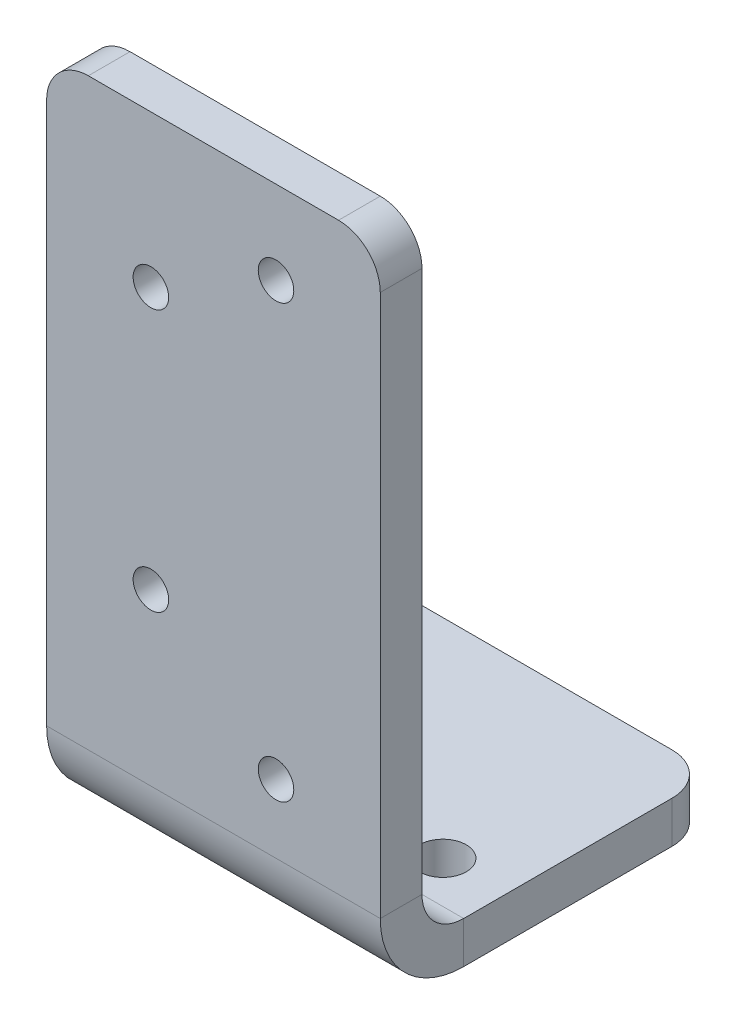
ISO-10303-21;
HEADER;
FILE_DESCRIPTION(('STEP AP214'),'2;1');
FILE_NAME('part.step','',(''),(''),'','','');
FILE_SCHEMA(('AUTOMOTIVE_DESIGN { 1 0 10303 214 1 1 1 1 }'));
ENDSEC;
DATA;
#1=APPLICATION_CONTEXT('core data for automotive mechanical design processes');
#2=APPLICATION_PROTOCOL_DEFINITION('international standard','automotive_design',2000,#1);
#3=PRODUCT_CONTEXT('',#1,'mechanical');
#4=PRODUCT('Part','Part','',(#3));
#5=PRODUCT_RELATED_PRODUCT_CATEGORY('part','',(#4));
#6=PRODUCT_DEFINITION_FORMATION('','',#4);
#7=PRODUCT_DEFINITION_CONTEXT('part definition',#1,'design');
#8=PRODUCT_DEFINITION('design','',#6,#7);
#9=PRODUCT_DEFINITION_SHAPE('','',#8);
#10=(LENGTH_UNIT() NAMED_UNIT(*) SI_UNIT(.MILLI.,.METRE.));
#11=(NAMED_UNIT(*) PLANE_ANGLE_UNIT() SI_UNIT($,.RADIAN.));
#12=(NAMED_UNIT(*) SI_UNIT($,.STERADIAN.) SOLID_ANGLE_UNIT());
#13=UNCERTAINTY_MEASURE_WITH_UNIT(LENGTH_MEASURE(1.E-05),#10,'distance_accuracy_value','');
#14=(GEOMETRIC_REPRESENTATION_CONTEXT(3) GLOBAL_UNCERTAINTY_ASSIGNED_CONTEXT((#13)) GLOBAL_UNIT_ASSIGNED_CONTEXT((#10,
#11,#12)) REPRESENTATION_CONTEXT('',''));
#15=CARTESIAN_POINT('',(0.,0.,0.));
#16=DIRECTION('',(0.,0.,1.));
#17=DIRECTION('',(1.,0.,0.));
#18=AXIS2_PLACEMENT_3D('',#15,#16,#17);
#19=CARTESIAN_POINT('',(50.7999999999997,6.34999999999952,-12.7));
#20=DIRECTION('',(1.,0.,0.));
#21=DIRECTION('',(0.,0.,-1.00000000000001));
#22=AXIS2_PLACEMENT_3D('',#19,#20,#21);
#23=PLANE('',#22);
#24=DIRECTION('',(0.,-1.,0.));
#25=VECTOR('',#24,1.);
#26=CARTESIAN_POINT('',(50.8000000000002,101.6,-6.35000000000008));
#27=LINE('',#26,#25);
#28=CARTESIAN_POINT('',(50.7999999999997,95.2500000000001,-6.34999999999997));
#29=VERTEX_POINT('',#28);
#30=CARTESIAN_POINT('',(50.8000000000002,12.6999999999998,-6.3500000133348));
#31=VERTEX_POINT('',#30);
#32=EDGE_CURVE('E226',#29,#31,#27,.T.);
#33=ORIENTED_EDGE('',*,*,#32,.F.);
#34=DIRECTION('',(0.,0.,-1.00000000000001));
#35=VECTOR('',#34,1.);
#36=CARTESIAN_POINT('',(50.7999999999997,95.2500000000001,-12.7));
#37=LINE('',#36,#35);
#38=CARTESIAN_POINT('',(50.7999999999997,95.2499999999998,0.));
#39=VERTEX_POINT('',#38);
#40=EDGE_CURVE('E254',#29,#39,#37,.F.);
#41=ORIENTED_EDGE('',*,*,#40,.T.);
#42=DIRECTION('',(0.,-1.,0.));
#43=VECTOR('',#42,1.);
#44=CARTESIAN_POINT('',(50.8000000000002,101.6,0.));
#45=LINE('',#44,#43);
#46=CARTESIAN_POINT('',(50.7999999999997,12.7000000000004,-8.89005535853471E-09));
#47=VERTEX_POINT('',#46);
#48=EDGE_CURVE('E229',#39,#47,#45,.T.);
#49=ORIENTED_EDGE('',*,*,#48,.T.);
#50=DIRECTION('',(0.,0.,-1.00000000000001));
#51=VECTOR('',#50,1.);
#52=CARTESIAN_POINT('',(50.8000000000006,12.699999999999,0.));
#53=LINE('',#52,#51);
#54=EDGE_CURVE('E265',#47,#31,#53,.T.);
#55=ORIENTED_EDGE('',*,*,#54,.T.);
#56=EDGE_LOOP('',(#33,#41,#49,#55));
#57=FACE_BOUND('',#56,.T.);
#58=ADVANCED_FACE('F40',(#57),#23,.T.);
#59=CARTESIAN_POINT('',(50.8000000000002,101.6,-6.35000000000008));
#60=DIRECTION('',(0.,0.,-1.00000000000001));
#61=DIRECTION('',(0.,1.,0.));
#62=AXIS2_PLACEMENT_3D('',#59,#60,#61);
#63=PLANE('',#62);
#64=CARTESIAN_POINT('',(15.8749999999999,78.4859999999998,-6.34999999999997));
#65=DIRECTION('',(0.,0.,-1.00000000000001));
#66=DIRECTION('',(0.,1.,0.));
#67=AXIS2_PLACEMENT_3D('',#64,#65,#66);
#68=CIRCLE('',#67,2.70510000000001);
#69=CARTESIAN_POINT('',(15.8749999999999,81.1910999999998,-6.34999999999997));
#70=VERTEX_POINT('',#69);
#71=EDGE_CURVE('E140',#70,#70,#68,.T.);
#72=ORIENTED_EDGE('',*,*,#71,.F.);
#73=EDGE_LOOP('',(#72));
#74=FACE_BOUND('',#73,.T.);
#75=CARTESIAN_POINT('',(15.8750000000007,38.6080000000006,-6.35000000000008));
#76=DIRECTION('',(0.,0.,-1.00000000000001));
#77=DIRECTION('',(0.,1.,0.));
#78=AXIS2_PLACEMENT_3D('',#75,#76,#77);
#79=CIRCLE('',#78,2.7051);
#80=CARTESIAN_POINT('',(15.8750000000007,41.3131000000006,-6.35000000000008));
#81=VERTEX_POINT('',#80);
#82=EDGE_CURVE('E209',#81,#81,#79,.T.);
#83=ORIENTED_EDGE('',*,*,#82,.F.);
#84=EDGE_LOOP('',(#83));
#85=FACE_BOUND('',#84,.T.);
#86=CARTESIAN_POINT('',(34.9249999999999,88.9000000000002,-6.35000000000008));
#87=DIRECTION('',(0.,0.,-1.00000000000001));
#88=DIRECTION('',(0.,1.,0.));
#89=AXIS2_PLACEMENT_3D('',#86,#87,#88);
#90=CIRCLE('',#89,2.70510000000001);
#91=CARTESIAN_POINT('',(34.9249999999999,91.6051000000002,-6.35000000000008));
#92=VERTEX_POINT('',#91);
#93=EDGE_CURVE('E213',#92,#92,#90,.T.);
#94=ORIENTED_EDGE('',*,*,#93,.F.);
#95=EDGE_LOOP('',(#94));
#96=FACE_BOUND('',#95,.T.);
#97=CARTESIAN_POINT('',(34.9249999999999,23.1139999999999,-6.34999999999997));
#98=DIRECTION('',(0.,0.,-1.00000000000001));
#99=DIRECTION('',(0.,1.,0.));
#100=AXIS2_PLACEMENT_3D('',#97,#98,#99);
#101=CIRCLE('',#100,2.70509999999999);
#102=CARTESIAN_POINT('',(34.9249999999999,25.8190999999999,-6.34999999999997));
#103=VERTEX_POINT('',#102);
#104=EDGE_CURVE('E217',#103,#103,#101,.T.);
#105=ORIENTED_EDGE('',*,*,#104,.F.);
#106=EDGE_LOOP('',(#105));
#107=FACE_BOUND('',#106,.T.);
#108=DIRECTION('',(-1.,0.,0.));
#109=VECTOR('',#108,1.);
#110=CARTESIAN_POINT('',(50.8000000000002,101.6,-6.35000000000008));
#111=LINE('',#110,#109);
#112=CARTESIAN_POINT('',(44.4499999999999,101.6,-6.35000000000002));
#113=VERTEX_POINT('',#112);
#114=CARTESIAN_POINT('',(6.34999999999986,101.6,-6.35000000000013));
#115=VERTEX_POINT('',#114);
#116=EDGE_CURVE('E234',#113,#115,#111,.T.);
#117=ORIENTED_EDGE('',*,*,#116,.F.);
#118=CARTESIAN_POINT('',(44.4500000000003,95.2500000000003,-6.34999999999991));
#119=DIRECTION('',(0.,0.,-1.00000000000001));
#120=DIRECTION('',(0.,1.,0.));
#121=AXIS2_PLACEMENT_3D('',#118,#119,#120);
#122=CIRCLE('',#121,6.35);
#123=EDGE_CURVE('E252',#113,#29,#122,.T.);
#124=ORIENTED_EDGE('',*,*,#123,.T.);
#125=ORIENTED_EDGE('',*,*,#32,.T.);
#126=DIRECTION('',(-1.,0.,0.));
#127=VECTOR('',#126,1.);
#128=CARTESIAN_POINT('',(50.8000000000006,12.699999999999,-6.34999999999991));
#129=LINE('',#128,#127);
#130=CARTESIAN_POINT('',(0.,12.6999999999995,-6.3500000133348));
#131=VERTEX_POINT('',#130);
#132=EDGE_CURVE('E262',#31,#131,#129,.T.);
#133=ORIENTED_EDGE('',*,*,#132,.T.);
#134=DIRECTION('',(0.,-1.,0.));
#135=VECTOR('',#134,1.);
#136=CARTESIAN_POINT('',(0.,101.6,-6.34999999999997));
#137=LINE('',#136,#135);
#138=CARTESIAN_POINT('',(0.,95.2500000000006,-6.35000000000002));
#139=VERTEX_POINT('',#138);
#140=EDGE_CURVE('E221',#139,#131,#137,.T.);
#141=ORIENTED_EDGE('',*,*,#140,.F.);
#142=CARTESIAN_POINT('',(6.34999999999986,95.2499999999993,-6.34999999999986));
#143=DIRECTION('',(0.,0.,-1.00000000000001));
#144=DIRECTION('',(0.,1.,0.));
#145=AXIS2_PLACEMENT_3D('',#142,#143,#144);
#146=CIRCLE('',#145,6.35);
#147=EDGE_CURVE('E250',#139,#115,#146,.T.);
#148=ORIENTED_EDGE('',*,*,#147,.T.);
#149=EDGE_LOOP('',(#117,#124,#125,#133,#141,#148));
#150=FACE_BOUND('',#149,.T.);
#151=ADVANCED_FACE('F304',(#74,#85,#96,#107,#150),#63,.T.);
#152=CARTESIAN_POINT('',(50.8000000000002,101.6,0.));
#153=DIRECTION('',(0.,1.,0.));
#154=DIRECTION('',(0.,0.,1.00000000000001));
#155=AXIS2_PLACEMENT_3D('',#152,#153,#154);
#156=PLANE('',#155);
#157=DIRECTION('',(-1.,0.,0.));
#158=VECTOR('',#157,1.);
#159=CARTESIAN_POINT('',(50.8000000000002,101.6,0.));
#160=LINE('',#159,#158);
#161=CARTESIAN_POINT('',(44.4500000000003,101.6,-1.11022302462516E-13));
#162=VERTEX_POINT('',#161);
#163=CARTESIAN_POINT('',(6.3500000000003,101.6,1.66533453693773E-13));
#164=VERTEX_POINT('',#163);
#165=EDGE_CURVE('E232',#162,#164,#160,.T.);
#166=ORIENTED_EDGE('',*,*,#165,.F.);
#167=DIRECTION('',(0.,0.,-1.00000000000001));
#168=VECTOR('',#167,1.);
#169=CARTESIAN_POINT('',(44.4500000000003,101.6,-1.11022302462516E-13));
#170=LINE('',#169,#168);
#171=EDGE_CURVE('E247',#162,#113,#170,.T.);
#172=ORIENTED_EDGE('',*,*,#171,.T.);
#173=ORIENTED_EDGE('',*,*,#116,.T.);
#174=DIRECTION('',(0.,0.,-1.00000000000001));
#175=VECTOR('',#174,1.);
#176=CARTESIAN_POINT('',(6.3500000000003,101.6,1.66533453693773E-13));
#177=LINE('',#176,#175);
#178=EDGE_CURVE('E237',#115,#164,#177,.F.);
#179=ORIENTED_EDGE('',*,*,#178,.T.);
#180=EDGE_LOOP('',(#166,#172,#173,#179));
#181=FACE_BOUND('',#180,.T.);
#182=ADVANCED_FACE('F311',(#181),#156,.T.);
#183=CARTESIAN_POINT('',(50.8000000000002,101.6,0.));
#184=DIRECTION('',(0.,0.,-1.00000000000001));
#185=DIRECTION('',(0.,1.,0.));
#186=AXIS2_PLACEMENT_3D('',#183,#184,#185);
#187=PLANE('',#186);
#188=CARTESIAN_POINT('',(15.8749999999999,78.4860000000001,0.));
#189=DIRECTION('',(0.,0.,-1.00000000000001));
#190=DIRECTION('',(0.,1.,0.));
#191=AXIS2_PLACEMENT_3D('',#188,#189,#190);
#192=CIRCLE('',#191,2.70510000000001);
#193=CARTESIAN_POINT('',(15.8749999999999,81.1911000000001,0.));
#194=VERTEX_POINT('',#193);
#195=EDGE_CURVE('E208',#194,#194,#192,.T.);
#196=ORIENTED_EDGE('',*,*,#195,.T.);
#197=EDGE_LOOP('',(#196));
#198=FACE_BOUND('',#197,.T.);
#199=CARTESIAN_POINT('',(15.8750000000003,38.6080000000002,0.));
#200=DIRECTION('',(0.,0.,-1.00000000000001));
#201=DIRECTION('',(0.,1.,0.));
#202=AXIS2_PLACEMENT_3D('',#199,#200,#201);
#203=CIRCLE('',#202,2.7051);
#204=CARTESIAN_POINT('',(15.8750000000003,41.3131000000002,0.));
#205=VERTEX_POINT('',#204);
#206=EDGE_CURVE('E212',#205,#205,#203,.T.);
#207=ORIENTED_EDGE('',*,*,#206,.T.);
#208=EDGE_LOOP('',(#207));
#209=FACE_BOUND('',#208,.T.);
#210=CARTESIAN_POINT('',(34.9249999999999,88.9000000000001,0.));
#211=DIRECTION('',(0.,0.,-1.00000000000001));
#212=DIRECTION('',(0.,1.,0.));
#213=AXIS2_PLACEMENT_3D('',#210,#211,#212);
#214=CIRCLE('',#213,2.70510000000001);
#215=CARTESIAN_POINT('',(34.9249999999999,91.6051000000001,0.));
#216=VERTEX_POINT('',#215);
#217=EDGE_CURVE('E216',#216,#216,#214,.T.);
#218=ORIENTED_EDGE('',*,*,#217,.T.);
#219=EDGE_LOOP('',(#218));
#220=FACE_BOUND('',#219,.T.);
#221=CARTESIAN_POINT('',(34.9249999999999,23.1140000000001,0.));
#222=DIRECTION('',(0.,0.,-1.00000000000001));
#223=DIRECTION('',(0.,1.,0.));
#224=AXIS2_PLACEMENT_3D('',#221,#222,#223);
#225=CIRCLE('',#224,2.70509999999999);
#226=CARTESIAN_POINT('',(34.9249999999999,25.8191000000001,0.));
#227=VERTEX_POINT('',#226);
#228=EDGE_CURVE('E220',#227,#227,#225,.T.);
#229=ORIENTED_EDGE('',*,*,#228,.T.);
#230=EDGE_LOOP('',(#229));
#231=FACE_BOUND('',#230,.T.);
#232=ORIENTED_EDGE('',*,*,#48,.F.);
#233=CARTESIAN_POINT('',(44.4500000000008,95.2499999999999,1.66533453693773E-13));
#234=DIRECTION('',(0.,0.,-1.00000000000001));
#235=DIRECTION('',(0.,1.,0.));
#236=AXIS2_PLACEMENT_3D('',#233,#234,#235);
#237=CIRCLE('',#236,6.35);
#238=EDGE_CURVE('E257',#39,#162,#237,.F.);
#239=ORIENTED_EDGE('',*,*,#238,.T.);
#240=ORIENTED_EDGE('',*,*,#165,.T.);
#241=CARTESIAN_POINT('',(6.34999999999986,95.2499999999998,0.));
#242=DIRECTION('',(0.,0.,-1.00000000000001));
#243=DIRECTION('',(0.,1.,0.));
#244=AXIS2_PLACEMENT_3D('',#241,#242,#243);
#245=CIRCLE('',#244,6.35);
#246=CARTESIAN_POINT('',(0.,95.2500000000003,0.));
#247=VERTEX_POINT('',#246);
#248=EDGE_CURVE('E61',#164,#247,#245,.F.);
#249=ORIENTED_EDGE('',*,*,#248,.T.);
#250=DIRECTION('',(0.,-1.,0.));
#251=VECTOR('',#250,1.);
#252=CARTESIAN_POINT('',(0.,101.6,0.));
#253=LINE('',#252,#251);
#254=CARTESIAN_POINT('',(0.,12.6999999999994,0.));
#255=VERTEX_POINT('',#254);
#256=EDGE_CURVE('E224',#247,#255,#253,.T.);
#257=ORIENTED_EDGE('',*,*,#256,.T.);
#258=DIRECTION('',(-1.,0.,0.));
#259=VECTOR('',#258,1.);
#260=CARTESIAN_POINT('',(50.8000000000006,12.699999999999,0.));
#261=LINE('',#260,#259);
#262=EDGE_CURVE('E47',#47,#255,#261,.T.);
#263=ORIENTED_EDGE('',*,*,#262,.F.);
#264=EDGE_LOOP('',(#232,#239,#240,#249,#257,#263));
#265=FACE_BOUND('',#264,.T.);
#266=ADVANCED_FACE('F313',(#198,#209,#220,#231,#265),#187,.F.);
#267=CARTESIAN_POINT('',(0.,12.6999999999995,-12.7));
#268=DIRECTION('',(1.,0.,0.));
#269=DIRECTION('',(0.,0.,-1.00000000000001));
#270=AXIS2_PLACEMENT_3D('',#267,#268,#269);
#271=PLANE('',#270);
#272=ORIENTED_EDGE('',*,*,#256,.F.);
#273=DIRECTION('',(0.,0.,-1.00000000000001));
#274=VECTOR('',#273,1.);
#275=CARTESIAN_POINT('',(0.,95.2500000000006,-6.35000000000002));
#276=LINE('',#275,#274);
#277=EDGE_CURVE('E259',#247,#139,#276,.T.);
#278=ORIENTED_EDGE('',*,*,#277,.T.);
#279=ORIENTED_EDGE('',*,*,#140,.T.);
#280=DIRECTION('',(0.,0.,1.00000000000001));
#281=VECTOR('',#280,1.);
#282=CARTESIAN_POINT('',(0.,12.6999999999996,-6.35000000000002));
#283=LINE('',#282,#281);
#284=EDGE_CURVE('E11',#131,#255,#283,.T.);
#285=ORIENTED_EDGE('',*,*,#284,.T.);
#286=EDGE_LOOP('',(#272,#278,#279,#285));
#287=FACE_BOUND('',#286,.T.);
#288=ADVANCED_FACE('F318',(#287),#271,.F.);
#289=CARTESIAN_POINT('',(34.9249999999999,23.1139999999996,6.34999999999991));
#290=DIRECTION('',(0.,0.,-1.00000000000001));
#291=DIRECTION('',(0.,1.,0.));
#292=AXIS2_PLACEMENT_3D('',#289,#290,#291);
#293=CYLINDRICAL_SURFACE('',#292,2.70509999999999);
#294=ORIENTED_EDGE('',*,*,#104,.T.);
#295=EDGE_LOOP('',(#294));
#296=FACE_BOUND('',#295,.T.);
#297=ORIENTED_EDGE('',*,*,#228,.F.);
#298=EDGE_LOOP('',(#297));
#299=FACE_BOUND('',#298,.T.);
#300=ADVANCED_FACE('F320',(#296,#299),#293,.F.);
#301=CARTESIAN_POINT('',(34.9249999999999,88.9000000000001,6.34999999999997));
#302=DIRECTION('',(0.,0.,-1.00000000000001));
#303=DIRECTION('',(0.,1.,0.));
#304=AXIS2_PLACEMENT_3D('',#301,#302,#303);
#305=CYLINDRICAL_SURFACE('',#304,2.70510000000001);
#306=ORIENTED_EDGE('',*,*,#93,.T.);
#307=EDGE_LOOP('',(#306));
#308=FACE_BOUND('',#307,.T.);
#309=ORIENTED_EDGE('',*,*,#217,.F.);
#310=EDGE_LOOP('',(#309));
#311=FACE_BOUND('',#310,.T.);
#312=ADVANCED_FACE('F326',(#308,#311),#305,.F.);
#313=CARTESIAN_POINT('',(15.8750000000003,38.6080000000002,6.35000000000002));
#314=DIRECTION('',(0.,0.,-1.00000000000001));
#315=DIRECTION('',(0.,1.,0.));
#316=AXIS2_PLACEMENT_3D('',#313,#314,#315);
#317=CYLINDRICAL_SURFACE('',#316,2.7051);
#318=ORIENTED_EDGE('',*,*,#82,.T.);
#319=EDGE_LOOP('',(#318));
#320=FACE_BOUND('',#319,.T.);
#321=ORIENTED_EDGE('',*,*,#206,.F.);
#322=EDGE_LOOP('',(#321));
#323=FACE_BOUND('',#322,.T.);
#324=ADVANCED_FACE('F353',(#320,#323),#317,.F.);
#325=CARTESIAN_POINT('',(15.8749999999999,78.4860000000003,6.34999999999997));
#326=DIRECTION('',(0.,0.,-1.00000000000001));
#327=DIRECTION('',(0.,1.,0.));
#328=AXIS2_PLACEMENT_3D('',#325,#326,#327);
#329=CYLINDRICAL_SURFACE('',#328,2.70510000000001);
#330=ORIENTED_EDGE('',*,*,#71,.T.);
#331=EDGE_LOOP('',(#330));
#332=FACE_BOUND('',#331,.T.);
#333=ORIENTED_EDGE('',*,*,#195,.F.);
#334=EDGE_LOOP('',(#333));
#335=FACE_BOUND('',#334,.T.);
#336=ADVANCED_FACE('F360',(#332,#335),#329,.F.);
#337=CARTESIAN_POINT('',(44.4500000000008,95.2499999999999,1.66533453693773E-13));
#338=DIRECTION('',(0.,0.,-1.00000000000001));
#339=DIRECTION('',(-1.,0.,0.));
#340=AXIS2_PLACEMENT_3D('',#337,#338,#339);
#341=CYLINDRICAL_SURFACE('',#340,6.35);
#342=ORIENTED_EDGE('',*,*,#238,.F.);
#343=ORIENTED_EDGE('',*,*,#40,.F.);
#344=ORIENTED_EDGE('',*,*,#123,.F.);
#345=ORIENTED_EDGE('',*,*,#171,.F.);
#346=EDGE_LOOP('',(#342,#343,#344,#345));
#347=FACE_BOUND('',#346,.T.);
#348=ADVANCED_FACE('F308',(#347),#341,.T.);
#349=CARTESIAN_POINT('',(6.34999999999986,95.2500000000001,-12.7000000000001));
#350=DIRECTION('',(0.,0.,1.00000000000001));
#351=DIRECTION('',(1.,0.,0.));
#352=AXIS2_PLACEMENT_3D('',#349,#350,#351);
#353=CYLINDRICAL_SURFACE('',#352,6.35);
#354=ORIENTED_EDGE('',*,*,#248,.F.);
#355=ORIENTED_EDGE('',*,*,#178,.F.);
#356=ORIENTED_EDGE('',*,*,#147,.F.);
#357=ORIENTED_EDGE('',*,*,#277,.F.);
#358=EDGE_LOOP('',(#354,#355,#356,#357));
#359=FACE_BOUND('',#358,.T.);
#360=ADVANCED_FACE('F316',(#359),#353,.T.);
#361=CARTESIAN_POINT('',(6.3500000000003,12.6999999999996,-44.4499999999999));
#362=DIRECTION('',(0.,-1.,0.));
#363=DIRECTION('',(0.,0.,-1.00000000000001));
#364=AXIS2_PLACEMENT_3D('',#361,#362,#363);
#365=CYLINDRICAL_SURFACE('',#364,6.35);
#366=CARTESIAN_POINT('',(6.34999999999986,6.3500000000003,-44.4500000000002));
#367=DIRECTION('',(0.,1.,0.));
#368=DIRECTION('',(0.,0.,1.00000000000001));
#369=AXIS2_PLACEMENT_3D('',#366,#367,#368);
#370=CIRCLE('',#369,6.35);
#371=CARTESIAN_POINT('',(6.34999999999986,6.3500000000003,-50.8000000000001));
#372=VERTEX_POINT('',#371);
#373=CARTESIAN_POINT('',(0.,6.34999999999963,-44.4500000000002));
#374=VERTEX_POINT('',#373);
#375=EDGE_CURVE('E180',#372,#374,#370,.T.);
#376=ORIENTED_EDGE('',*,*,#375,.F.);
#377=DIRECTION('',(0.,-1.,0.));
#378=VECTOR('',#377,1.);
#379=CARTESIAN_POINT('',(6.34999999999986,6.3500000000003,-50.8000000000001));
#380=LINE('',#379,#378);
#381=CARTESIAN_POINT('',(6.3500000000003,-2.22044604925031E-13,-50.8000000000001));
#382=VERTEX_POINT('',#381);
#383=EDGE_CURVE('E196',#382,#372,#380,.F.);
#384=ORIENTED_EDGE('',*,*,#383,.F.);
#385=CARTESIAN_POINT('',(6.3500000000003,-4.44089209850063E-13,-44.45));
#386=DIRECTION('',(0.,1.,0.));
#387=DIRECTION('',(0.,0.,1.00000000000001));
#388=AXIS2_PLACEMENT_3D('',#385,#386,#387);
#389=CIRCLE('',#388,6.35);
#390=CARTESIAN_POINT('',(0.,2.22044604925031E-13,-44.4500000000001));
#391=VERTEX_POINT('',#390);
#392=EDGE_CURVE('E157',#391,#382,#389,.F.);
#393=ORIENTED_EDGE('',*,*,#392,.F.);
#394=DIRECTION('',(0.,-1.,0.));
#395=VECTOR('',#394,1.);
#396=CARTESIAN_POINT('',(0.,12.6999999999995,-44.45));
#397=LINE('',#396,#395);
#398=EDGE_CURVE('E141',#374,#391,#397,.T.);
#399=ORIENTED_EDGE('',*,*,#398,.F.);
#400=EDGE_LOOP('',(#376,#384,#393,#399));
#401=FACE_BOUND('',#400,.T.);
#402=ADVANCED_FACE('F288',(#401),#365,.T.);
#403=CARTESIAN_POINT('',(50.7999999999997,6.34999999999974,-50.8));
#404=DIRECTION('',(0.,0.,-1.00000000000001));
#405=DIRECTION('',(-1.,0.,0.));
#406=AXIS2_PLACEMENT_3D('',#403,#404,#405);
#407=PLANE('',#406);
#408=DIRECTION('',(-1.,0.,0.));
#409=VECTOR('',#408,1.);
#410=CARTESIAN_POINT('',(50.7999999999997,6.34999999999974,-50.8));
#411=LINE('',#410,#409);
#412=CARTESIAN_POINT('',(44.4500000000003,6.35000000000008,-50.8000000000004));
#413=VERTEX_POINT('',#412);
#414=EDGE_CURVE('E182',#413,#372,#411,.T.);
#415=ORIENTED_EDGE('',*,*,#414,.F.);
#416=DIRECTION('',(0.,-1.,0.));
#417=VECTOR('',#416,1.);
#418=CARTESIAN_POINT('',(44.4500000000003,6.35000000000008,-50.8000000000004));
#419=LINE('',#418,#417);
#420=CARTESIAN_POINT('',(44.4499999999999,-1.11022302462516E-13,-50.8));
#421=VERTEX_POINT('',#420);
#422=EDGE_CURVE('E201',#413,#421,#419,.T.);
#423=ORIENTED_EDGE('',*,*,#422,.T.);
#424=DIRECTION('',(-1.,0.,0.));
#425=VECTOR('',#424,1.);
#426=CARTESIAN_POINT('',(50.8000000000002,-2.22044604925031E-13,-50.8000000000001));
#427=LINE('',#426,#425);
#428=EDGE_CURVE('E198',#421,#382,#427,.T.);
#429=ORIENTED_EDGE('',*,*,#428,.T.);
#430=ORIENTED_EDGE('',*,*,#383,.T.);
#431=EDGE_LOOP('',(#415,#423,#429,#430));
#432=FACE_BOUND('',#431,.T.);
#433=ADVANCED_FACE('F285',(#432),#407,.T.);
#434=CARTESIAN_POINT('',(44.4500000000003,6.35000000000008,-44.4499999999999));
#435=DIRECTION('',(0.,-1.,0.));
#436=DIRECTION('',(0.,0.,-1.00000000000001));
#437=AXIS2_PLACEMENT_3D('',#434,#435,#436);
#438=CYLINDRICAL_SURFACE('',#437,6.35);
#439=CARTESIAN_POINT('',(44.4500000000003,6.35000000000008,-44.4499999999999));
#440=DIRECTION('',(0.,1.,0.));
#441=DIRECTION('',(0.,0.,1.00000000000001));
#442=AXIS2_PLACEMENT_3D('',#439,#440,#441);
#443=CIRCLE('',#442,6.35);
#444=CARTESIAN_POINT('',(50.7999999999997,6.34999999999974,-44.4499999999999));
#445=VERTEX_POINT('',#444);
#446=EDGE_CURVE('E185',#445,#413,#443,.T.);
#447=ORIENTED_EDGE('',*,*,#446,.F.);
#448=DIRECTION('',(0.,-1.,0.));
#449=VECTOR('',#448,1.);
#450=CARTESIAN_POINT('',(50.8000000000011,12.6999999999988,-44.45));
#451=LINE('',#450,#449);
#452=CARTESIAN_POINT('',(50.8000000000002,-2.22044604925031E-13,-44.4499999999999));
#453=VERTEX_POINT('',#452);
#454=EDGE_CURVE('E177',#453,#445,#451,.F.);
#455=ORIENTED_EDGE('',*,*,#454,.F.);
#456=CARTESIAN_POINT('',(44.4499999999999,-1.11022302462516E-13,-44.4499999999997));
#457=DIRECTION('',(0.,1.,0.));
#458=DIRECTION('',(0.,0.,1.00000000000001));
#459=AXIS2_PLACEMENT_3D('',#456,#457,#458);
#460=CIRCLE('',#459,6.35);
#461=EDGE_CURVE('E164',#421,#453,#460,.F.);
#462=ORIENTED_EDGE('',*,*,#461,.F.);
#463=ORIENTED_EDGE('',*,*,#422,.F.);
#464=EDGE_LOOP('',(#447,#455,#462,#463));
#465=FACE_BOUND('',#464,.T.);
#466=ADVANCED_FACE('F294',(#465),#438,.T.);
#467=CARTESIAN_POINT('',(41.2750000000006,-6.34999999999997,-19.0500000000001));
#468=DIRECTION('',(0.,1.,0.));
#469=DIRECTION('',(0.,0.,1.00000000000001));
#470=AXIS2_PLACEMENT_3D('',#467,#468,#469);
#471=CYLINDRICAL_SURFACE('',#470,3.5687);
#472=CARTESIAN_POINT('',(41.2750000000002,6.35000000000008,-19.0500000000001));
#473=DIRECTION('',(0.,1.,0.));
#474=DIRECTION('',(0.,0.,1.00000000000001));
#475=AXIS2_PLACEMENT_3D('',#472,#473,#474);
#476=CIRCLE('',#475,3.5687);
#477=CARTESIAN_POINT('',(41.2750000000002,6.35000000000008,-15.4813));
#478=VERTEX_POINT('',#477);
#479=EDGE_CURVE('E193',#478,#478,#476,.T.);
#480=ORIENTED_EDGE('',*,*,#479,.T.);
#481=EDGE_LOOP('',(#480));
#482=FACE_BOUND('',#481,.T.);
#483=CARTESIAN_POINT('',(41.2749999999997,-1.11022302462516E-13,-19.0500000000002));
#484=DIRECTION('',(0.,1.,0.));
#485=DIRECTION('',(0.,0.,1.00000000000001));
#486=AXIS2_PLACEMENT_3D('',#483,#484,#485);
#487=CIRCLE('',#486,3.5687);
#488=CARTESIAN_POINT('',(41.2749999999997,-1.11022302462516E-13,-15.4813000000001));
#489=VERTEX_POINT('',#488);
#490=EDGE_CURVE('E166',#489,#489,#487,.T.);
#491=ORIENTED_EDGE('',*,*,#490,.F.);
#492=EDGE_LOOP('',(#491));
#493=FACE_BOUND('',#492,.T.);
#494=ADVANCED_FACE('F384',(#482,#493),#471,.F.);
#495=CARTESIAN_POINT('',(9.52500000000001,-6.35000000000019,-41.275));
#496=DIRECTION('',(0.,1.,0.));
#497=DIRECTION('',(0.,0.,1.00000000000001));
#498=AXIS2_PLACEMENT_3D('',#495,#496,#497);
#499=CYLINDRICAL_SURFACE('',#498,3.56870000000001);
#500=CARTESIAN_POINT('',(9.52499999999956,6.3499999999993,-41.275));
#501=DIRECTION('',(0.,1.,0.));
#502=DIRECTION('',(0.,0.,1.00000000000001));
#503=AXIS2_PLACEMENT_3D('',#500,#501,#502);
#504=CIRCLE('',#503,3.56870000000001);
#505=CARTESIAN_POINT('',(9.52499999999956,6.3499999999993,-37.7063));
#506=VERTEX_POINT('',#505);
#507=EDGE_CURVE('E190',#506,#506,#504,.T.);
#508=ORIENTED_EDGE('',*,*,#507,.T.);
#509=EDGE_LOOP('',(#508));
#510=FACE_BOUND('',#509,.T.);
#511=CARTESIAN_POINT('',(9.52500000000001,-5.55111512312578E-13,-41.275));
#512=DIRECTION('',(0.,1.,0.));
#513=DIRECTION('',(0.,0.,1.00000000000001));
#514=AXIS2_PLACEMENT_3D('',#511,#512,#513);
#515=CIRCLE('',#514,3.56870000000001);
#516=CARTESIAN_POINT('',(9.52500000000001,-5.55111512312578E-13,-37.7062999999999));
#517=VERTEX_POINT('',#516);
#518=EDGE_CURVE('E172',#517,#517,#515,.T.);
#519=ORIENTED_EDGE('',*,*,#518,.F.);
#520=EDGE_LOOP('',(#519));
#521=FACE_BOUND('',#520,.T.);
#522=ADVANCED_FACE('F380',(#510,#521),#499,.F.);
#523=CARTESIAN_POINT('',(50.7999999999997,6.34999999999974,0.));
#524=DIRECTION('',(0.,1.,0.));
#525=DIRECTION('',(0.,0.,1.00000000000001));
#526=AXIS2_PLACEMENT_3D('',#523,#524,#525);
#527=PLANE('',#526);
#528=ORIENTED_EDGE('',*,*,#507,.F.);
#529=EDGE_LOOP('',(#528));
#530=FACE_BOUND('',#529,.T.);
#531=ORIENTED_EDGE('',*,*,#479,.F.);
#532=EDGE_LOOP('',(#531));
#533=FACE_BOUND('',#532,.T.);
#534=DIRECTION('',(0.,0.,-1.00000000000001));
#535=VECTOR('',#534,1.);
#536=CARTESIAN_POINT('',(50.7999999999997,6.34999999999974,0.));
#537=LINE('',#536,#535);
#538=CARTESIAN_POINT('',(50.8000000000002,6.35000000444486,-12.6999999999999));
#539=VERTEX_POINT('',#538);
#540=EDGE_CURVE('E187',#539,#445,#537,.T.);
#541=ORIENTED_EDGE('',*,*,#540,.T.);
#542=ORIENTED_EDGE('',*,*,#446,.T.);
#543=ORIENTED_EDGE('',*,*,#414,.T.);
#544=ORIENTED_EDGE('',*,*,#375,.T.);
#545=DIRECTION('',(0.,0.,-1.00000000000001));
#546=VECTOR('',#545,1.);
#547=CARTESIAN_POINT('',(0.,6.34999999999963,0.));
#548=LINE('',#547,#546);
#549=CARTESIAN_POINT('',(-4.44089209850063E-13,6.35000000888952,-12.7));
#550=VERTEX_POINT('',#549);
#551=EDGE_CURVE('E280',#550,#374,#548,.T.);
#552=ORIENTED_EDGE('',*,*,#551,.F.);
#553=DIRECTION('',(-1.,0.,0.));
#554=VECTOR('',#553,1.);
#555=CARTESIAN_POINT('',(50.7999999999997,6.34999999999952,-12.7));
#556=LINE('',#555,#554);
#557=EDGE_CURVE('E204',#539,#550,#556,.T.);
#558=ORIENTED_EDGE('',*,*,#557,.F.);
#559=EDGE_LOOP('',(#541,#542,#543,#544,#552,#558));
#560=FACE_BOUND('',#559,.T.);
#561=ADVANCED_FACE('F290',(#530,#533,#560),#527,.T.);
#562=CARTESIAN_POINT('',(50.8000000000002,12.6999999999994,-12.7000000000001));
#563=DIRECTION('',(1.,0.,0.));
#564=DIRECTION('',(0.,0.,-1.00000000000001));
#565=AXIS2_PLACEMENT_3D('',#562,#563,#564);
#566=PLANE('',#565);
#567=DIRECTION('',(0.,0.,-1.00000000000001));
#568=VECTOR('',#567,1.);
#569=CARTESIAN_POINT('',(50.8000000000002,-4.44089209850063E-13,0.));
#570=LINE('',#569,#568);
#571=CARTESIAN_POINT('',(50.8000000000002,-2.22044604925031E-13,-12.7));
#572=VERTEX_POINT('',#571);
#573=EDGE_CURVE('E162',#572,#453,#570,.T.);
#574=ORIENTED_EDGE('',*,*,#573,.T.);
#575=ORIENTED_EDGE('',*,*,#454,.T.);
#576=ORIENTED_EDGE('',*,*,#540,.F.);
#577=DIRECTION('',(0.,-1.,0.));
#578=VECTOR('',#577,1.);
#579=CARTESIAN_POINT('',(50.7999999999997,6.34999999999952,-12.7));
#580=LINE('',#579,#578);
#581=EDGE_CURVE('E175',#539,#572,#580,.T.);
#582=ORIENTED_EDGE('',*,*,#581,.T.);
#583=EDGE_LOOP('',(#574,#575,#576,#582));
#584=FACE_BOUND('',#583,.T.);
#585=ADVANCED_FACE('F297',(#584),#566,.T.);
#586=CARTESIAN_POINT('',(50.8000000000002,-4.44089209850063E-13,0.));
#587=DIRECTION('',(0.,1.,0.));
#588=DIRECTION('',(0.,0.,1.00000000000001));
#589=AXIS2_PLACEMENT_3D('',#586,#587,#588);
#590=PLANE('',#589);
#591=ORIENTED_EDGE('',*,*,#518,.T.);
#592=EDGE_LOOP('',(#591));
#593=FACE_BOUND('',#592,.T.);
#594=ORIENTED_EDGE('',*,*,#490,.T.);
#595=EDGE_LOOP('',(#594));
#596=FACE_BOUND('',#595,.T.);
#597=ORIENTED_EDGE('',*,*,#428,.F.);
#598=ORIENTED_EDGE('',*,*,#461,.T.);
#599=ORIENTED_EDGE('',*,*,#573,.F.);
#600=DIRECTION('',(-1.,0.,0.));
#601=VECTOR('',#600,1.);
#602=CARTESIAN_POINT('',(50.8000000000002,-2.22044604925031E-13,-12.7));
#603=LINE('',#602,#601);
#604=CARTESIAN_POINT('',(0.,8.88955575817363E-09,-12.7));
#605=VERTEX_POINT('',#604);
#606=EDGE_CURVE('E146',#572,#605,#603,.T.);
#607=ORIENTED_EDGE('',*,*,#606,.T.);
#608=DIRECTION('',(0.,0.,-1.00000000000001));
#609=VECTOR('',#608,1.);
#610=CARTESIAN_POINT('',(0.,0.,0.));
#611=LINE('',#610,#609);
#612=EDGE_CURVE('E153',#605,#391,#611,.T.);
#613=ORIENTED_EDGE('',*,*,#612,.T.);
#614=ORIENTED_EDGE('',*,*,#392,.T.);
#615=EDGE_LOOP('',(#597,#598,#599,#607,#613,#614));
#616=FACE_BOUND('',#615,.T.);
#617=ADVANCED_FACE('F160',(#593,#596,#616),#590,.F.);
#618=CARTESIAN_POINT('',(0.,12.6999999999996,-6.35000000000002));
#619=DIRECTION('',(-1.,0.,0.));
#620=DIRECTION('',(0.,0.,1.00000000000001));
#621=AXIS2_PLACEMENT_3D('',#618,#619,#620);
#622=PLANE('',#621);
#623=ORIENTED_EDGE('',*,*,#551,.T.);
#624=ORIENTED_EDGE('',*,*,#398,.T.);
#625=ORIENTED_EDGE('',*,*,#612,.F.);
#626=DIRECTION('',(0.,1.,0.));
#627=VECTOR('',#626,1.);
#628=CARTESIAN_POINT('',(0.,0.,-12.7));
#629=LINE('',#628,#627);
#630=EDGE_CURVE('E131',#605,#550,#629,.T.);
#631=ORIENTED_EDGE('',*,*,#630,.T.);
#632=EDGE_LOOP('',(#623,#624,#625,#631));
#633=FACE_BOUND('',#632,.T.);
#634=ADVANCED_FACE('F154',(#633),#622,.T.);
#635=CARTESIAN_POINT('',(50.8000000000002,12.6999999911097,-12.7000000000001));
#636=DIRECTION('',(-1.,0.,0.));
#637=DIRECTION('',(0.,0.,1.00000000000001));
#638=AXIS2_PLACEMENT_3D('',#635,#636,#637);
#639=PLANE('',#638);
#640=ORIENTED_EDGE('',*,*,#54,.F.);
#641=CARTESIAN_POINT('',(50.8000000000002,12.6999999999994,-12.7000000000001));
#642=DIRECTION('',(1.,0.,0.));
#643=DIRECTION('',(0.,0.,-1.00000000000001));
#644=AXIS2_PLACEMENT_3D('',#641,#642,#643);
#645=CIRCLE('',#644,12.6999999911101);
#646=EDGE_CURVE('E149',#47,#572,#645,.T.);
#647=ORIENTED_EDGE('',*,*,#646,.T.);
#648=ORIENTED_EDGE('',*,*,#581,.F.);
#649=CARTESIAN_POINT('',(50.8000000000002,12.6999999911097,-12.7000000000001));
#650=DIRECTION('',(1.,0.,0.));
#651=DIRECTION('',(0.,0.,-1.00000000000001));
#652=AXIS2_PLACEMENT_3D('',#649,#650,#651);
#653=CIRCLE('',#652,6.34999998666513);
#654=EDGE_CURVE('E148',#31,#539,#653,.T.);
#655=ORIENTED_EDGE('',*,*,#654,.F.);
#656=EDGE_LOOP('',(#640,#647,#648,#655));
#657=FACE_BOUND('',#656,.T.);
#658=ADVANCED_FACE('F272',(#657),#639,.F.);
#659=CARTESIAN_POINT('',(0.,12.6999999911098,-12.7000000000001));
#660=DIRECTION('',(1.,0.,0.));
#661=DIRECTION('',(0.,0.,-1.00000000000001));
#662=AXIS2_PLACEMENT_3D('',#659,#660,#661);
#663=PLANE('',#662);
#664=ORIENTED_EDGE('',*,*,#630,.F.);
#665=CARTESIAN_POINT('',(0.,12.6999999999995,-12.7));
#666=DIRECTION('',(1.,0.,0.));
#667=DIRECTION('',(0.,0.,-1.00000000000001));
#668=AXIS2_PLACEMENT_3D('',#665,#666,#667);
#669=CIRCLE('',#668,12.6999999911101);
#670=EDGE_CURVE('E133',#605,#255,#669,.F.);
#671=ORIENTED_EDGE('',*,*,#670,.T.);
#672=ORIENTED_EDGE('',*,*,#284,.F.);
#673=CARTESIAN_POINT('',(0.,12.6999999911098,-12.7000000000001));
#674=DIRECTION('',(-1.,0.,0.));
#675=DIRECTION('',(0.,0.,1.00000000000001));
#676=AXIS2_PLACEMENT_3D('',#673,#674,#675);
#677=CIRCLE('',#676,6.34999998666513);
#678=EDGE_CURVE('E135',#550,#131,#677,.T.);
#679=ORIENTED_EDGE('',*,*,#678,.F.);
#680=EDGE_LOOP('',(#664,#671,#672,#679));
#681=FACE_BOUND('',#680,.T.);
#682=ADVANCED_FACE('F132',(#681),#663,.F.);
#683=CARTESIAN_POINT('',(-27.9368447412094,12.7000000000004,-12.7000000000001));
#684=DIRECTION('',(1.,0.,0.));
#685=DIRECTION('',(0.,0.,-1.00000000000001));
#686=AXIS2_PLACEMENT_3D('',#683,#684,#685);
#687=CYLINDRICAL_SURFACE('',#686,6.34999999111009);
#688=ORIENTED_EDGE('',*,*,#678,.T.);
#689=ORIENTED_EDGE('',*,*,#132,.F.);
#690=ORIENTED_EDGE('',*,*,#654,.T.);
#691=ORIENTED_EDGE('',*,*,#557,.T.);
#692=EDGE_LOOP('',(#688,#689,#690,#691));
#693=FACE_BOUND('',#692,.T.);
#694=ADVANCED_FACE('F300',(#693),#687,.F.);
#695=CARTESIAN_POINT('',(-27.9368447412094,12.7000000000004,-12.7000000000001));
#696=DIRECTION('',(1.,0.,0.));
#697=DIRECTION('',(0.,0.,-1.00000000000001));
#698=AXIS2_PLACEMENT_3D('',#695,#696,#697);
#699=CYLINDRICAL_SURFACE('',#698,12.6999999911101);
#700=ORIENTED_EDGE('',*,*,#670,.F.);
#701=ORIENTED_EDGE('',*,*,#606,.F.);
#702=ORIENTED_EDGE('',*,*,#646,.F.);
#703=ORIENTED_EDGE('',*,*,#262,.T.);
#704=EDGE_LOOP('',(#700,#701,#702,#703));
#705=FACE_BOUND('',#704,.T.);
#706=ADVANCED_FACE('F144',(#705),#699,.T.);
#707=CLOSED_SHELL('',(#58,#151,#182,#266,#288,#300,#312,#324,#336,#348,#360,#402,#433,#466,#494,
#522,#561,#585,#617,#634,#658,#682,#694,#706));
#708=MANIFOLD_SOLID_BREP('B2',#707);
#709=ADVANCED_BREP_SHAPE_REPRESENTATION('',(#18,#708),#14);
#710=SHAPE_DEFINITION_REPRESENTATION(#9,#709);
ENDSEC;
END-ISO-10303-21;
